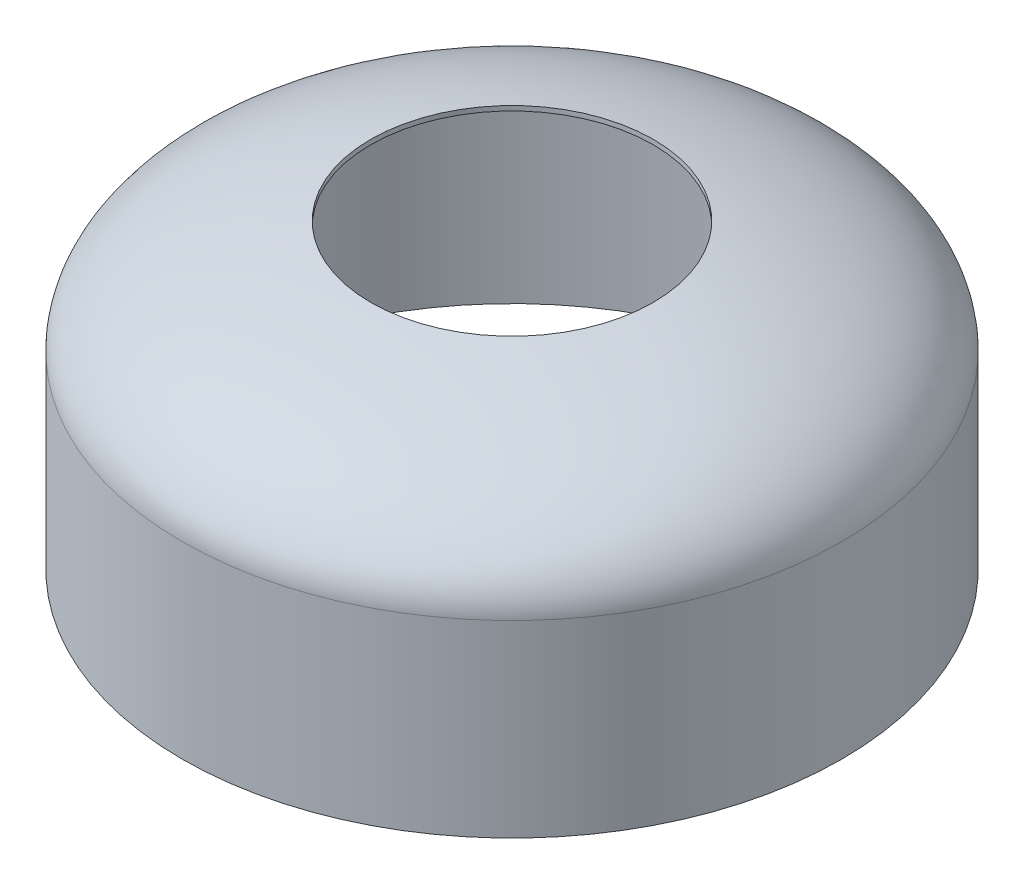
ISO-10303-21;
HEADER;
FILE_DESCRIPTION(('STEP AP214'),'2;1');
FILE_NAME('part.step','',(''),(''),'','','');
FILE_SCHEMA(('AUTOMOTIVE_DESIGN { 1 0 10303 214 1 1 1 1 }'));
ENDSEC;
DATA;
#1=APPLICATION_CONTEXT('core data for automotive mechanical design processes');
#2=APPLICATION_PROTOCOL_DEFINITION('international standard','automotive_design',2000,#1);
#3=PRODUCT_CONTEXT('',#1,'mechanical');
#4=PRODUCT('Part','Part','',(#3));
#5=PRODUCT_RELATED_PRODUCT_CATEGORY('part','',(#4));
#6=PRODUCT_DEFINITION_FORMATION('','',#4);
#7=PRODUCT_DEFINITION_CONTEXT('part definition',#1,'design');
#8=PRODUCT_DEFINITION('design','',#6,#7);
#9=PRODUCT_DEFINITION_SHAPE('','',#8);
#10=(LENGTH_UNIT() NAMED_UNIT(*) SI_UNIT(.MILLI.,.METRE.));
#11=(NAMED_UNIT(*) PLANE_ANGLE_UNIT() SI_UNIT($,.RADIAN.));
#12=(NAMED_UNIT(*) SI_UNIT($,.STERADIAN.) SOLID_ANGLE_UNIT());
#13=UNCERTAINTY_MEASURE_WITH_UNIT(LENGTH_MEASURE(1.E-05),#10,'distance_accuracy_value','');
#14=(GEOMETRIC_REPRESENTATION_CONTEXT(3) GLOBAL_UNCERTAINTY_ASSIGNED_CONTEXT((#13)) GLOBAL_UNIT_ASSIGNED_CONTEXT((#10,
#11,#12)) REPRESENTATION_CONTEXT('',''));
#15=CARTESIAN_POINT('',(0.,0.,0.));
#16=DIRECTION('',(0.,0.,1.));
#17=DIRECTION('',(1.,0.,0.));
#18=AXIS2_PLACEMENT_3D('',#15,#16,#17);
#19=CARTESIAN_POINT('',(175.26,-101.6,0.));
#20=DIRECTION('',(0.,-1.,0.));
#21=DIRECTION('',(0.,0.,-1.));
#22=AXIS2_PLACEMENT_3D('',#19,#20,#21);
#23=PLANE('',#22);
#24=CARTESIAN_POINT('',(0.,-101.6,0.));
#25=DIRECTION('',(0.,-1.,0.));
#26=DIRECTION('',(0.,0.,-1.));
#27=AXIS2_PLACEMENT_3D('',#24,#25,#26);
#28=CIRCLE('',#27,177.8);
#29=CARTESIAN_POINT('',(0.,-101.6,-177.8));
#30=VERTEX_POINT('',#29);
#31=EDGE_CURVE('E10',#30,#30,#28,.T.);
#32=ORIENTED_EDGE('',*,*,#31,.T.);
#33=EDGE_LOOP('',(#32));
#34=FACE_BOUND('',#33,.T.);
#35=CARTESIAN_POINT('',(0.,-101.6,0.));
#36=DIRECTION('',(0.,-1.,0.));
#37=DIRECTION('',(0.,0.,-1.));
#38=AXIS2_PLACEMENT_3D('',#35,#36,#37);
#39=CIRCLE('',#38,175.26);
#40=CARTESIAN_POINT('',(0.,-101.6,-175.26));
#41=VERTEX_POINT('',#40);
#42=EDGE_CURVE('E53',#41,#41,#39,.T.);
#43=ORIENTED_EDGE('',*,*,#42,.F.);
#44=EDGE_LOOP('',(#43));
#45=FACE_BOUND('',#44,.T.);
#46=ADVANCED_FACE('F31',(#34,#45),#23,.T.);
#47=CARTESIAN_POINT('',(0.,-109.728,0.));
#48=DIRECTION('',(0.,-1.,0.));
#49=DIRECTION('',(0.,0.,-1.));
#50=AXIS2_PLACEMENT_3D('',#47,#48,#49);
#51=CYLINDRICAL_SURFACE('',#50,177.8);
#52=CARTESIAN_POINT('',(0.,0.,0.));
#53=DIRECTION('',(0.,-1.,0.));
#54=DIRECTION('',(0.,0.,-1.));
#55=AXIS2_PLACEMENT_3D('',#52,#53,#54);
#56=CIRCLE('',#55,177.8);
#57=CARTESIAN_POINT('',(0.,0.,-177.8));
#58=VERTEX_POINT('',#57);
#59=EDGE_CURVE('E37',#58,#58,#56,.T.);
#60=ORIENTED_EDGE('',*,*,#59,.T.);
#61=EDGE_LOOP('',(#60));
#62=FACE_BOUND('',#61,.T.);
#63=ORIENTED_EDGE('',*,*,#31,.F.);
#64=EDGE_LOOP('',(#63));
#65=FACE_BOUND('',#64,.T.);
#66=ADVANCED_FACE('F72',(#62,#65),#51,.T.);
#67=CARTESIAN_POINT('',(0.,0.,0.));
#68=DIRECTION('',(0.,0.,1.));
#69=DIRECTION('',(1.,0.,0.));
#70=AXIS2_PLACEMENT_3D('',#67,#68,#69);
#71=ELLIPSE('',#70,177.8,67.4703561573525);
#72=TRIMMED_CURVE('',#71,(PARAMETER_VALUE(-1.5707963267949)),(PARAMETER_VALUE(1.5707963267949)),
.T.,.PARAMETER.);
#73=CARTESIAN_POINT('',(0.,-109.728,0.));
#74=DIRECTION('',(0.,-1.,0.));
#75=AXIS1_PLACEMENT('',#73,#74);
#76=SURFACE_OF_REVOLUTION('',#72,#75);
#77=CARTESIAN_POINT('',(0.,60.96,0.));
#78=DIRECTION('',(0.,-1.,0.));
#79=DIRECTION('',(0.,0.,-1.));
#80=AXIS2_PLACEMENT_3D('',#77,#78,#79);
#81=CIRCLE('',#80,76.2);
#82=CARTESIAN_POINT('',(0.,60.96,-76.2));
#83=VERTEX_POINT('',#82);
#84=EDGE_CURVE('E41',#83,#83,#81,.T.);
#85=ORIENTED_EDGE('',*,*,#84,.T.);
#86=EDGE_LOOP('',(#85));
#87=FACE_BOUND('',#86,.T.);
#88=ORIENTED_EDGE('',*,*,#59,.F.);
#89=EDGE_LOOP('',(#88));
#90=FACE_BOUND('',#89,.T.);
#91=ADVANCED_FACE('F69',(#87,#90),#76,.F.);
#92=CARTESIAN_POINT('',(0.,-109.728,0.));
#93=DIRECTION('',(0.,-1.,0.));
#94=DIRECTION('',(0.,0.,-1.));
#95=AXIS2_PLACEMENT_3D('',#92,#93,#94);
#96=CYLINDRICAL_SURFACE('',#95,76.2);
#97=CARTESIAN_POINT('',(0.,58.42,0.));
#98=DIRECTION('',(0.,-1.,0.));
#99=DIRECTION('',(0.,0.,-1.));
#100=AXIS2_PLACEMENT_3D('',#97,#98,#99);
#101=CIRCLE('',#100,76.2);
#102=CARTESIAN_POINT('',(0.,58.42,-76.2));
#103=VERTEX_POINT('',#102);
#104=EDGE_CURVE('E45',#103,#103,#101,.T.);
#105=ORIENTED_EDGE('',*,*,#104,.T.);
#106=EDGE_LOOP('',(#105));
#107=FACE_BOUND('',#106,.T.);
#108=ORIENTED_EDGE('',*,*,#84,.F.);
#109=EDGE_LOOP('',(#108));
#110=FACE_BOUND('',#109,.T.);
#111=ADVANCED_FACE('F65',(#107,#110),#96,.F.);
#112=CARTESIAN_POINT('',(0.,0.,0.));
#113=DIRECTION('',(0.,0.,-1.));
#114=DIRECTION('',(1.,0.,0.));
#115=AXIS2_PLACEMENT_3D('',#112,#113,#114);
#116=ELLIPSE('',#115,175.26,64.8725161095741);
#117=TRIMMED_CURVE('',#116,(PARAMETER_VALUE(4.71238898038469)),
(PARAMETER_VALUE(7.85398163397448)),.T.,.PARAMETER.);
#118=CARTESIAN_POINT('',(0.,-109.728,0.));
#119=DIRECTION('',(0.,-1.,0.));
#120=AXIS1_PLACEMENT('',#118,#119);
#121=SURFACE_OF_REVOLUTION('',#117,#120);
#122=CARTESIAN_POINT('',(0.,0.,0.));
#123=DIRECTION('',(0.,-1.,0.));
#124=DIRECTION('',(0.,0.,-1.));
#125=AXIS2_PLACEMENT_3D('',#122,#123,#124);
#126=CIRCLE('',#125,175.26);
#127=CARTESIAN_POINT('',(0.,0.,-175.26));
#128=VERTEX_POINT('',#127);
#129=EDGE_CURVE('E50',#128,#128,#126,.T.);
#130=ORIENTED_EDGE('',*,*,#129,.T.);
#131=EDGE_LOOP('',(#130));
#132=FACE_BOUND('',#131,.T.);
#133=ORIENTED_EDGE('',*,*,#104,.F.);
#134=EDGE_LOOP('',(#133));
#135=FACE_BOUND('',#134,.T.);
#136=ADVANCED_FACE('F60',(#132,#135),#121,.F.);
#137=CARTESIAN_POINT('',(0.,-109.728,0.));
#138=DIRECTION('',(0.,-1.,0.));
#139=DIRECTION('',(0.,0.,-1.));
#140=AXIS2_PLACEMENT_3D('',#137,#138,#139);
#141=CYLINDRICAL_SURFACE('',#140,175.26);
#142=ORIENTED_EDGE('',*,*,#42,.T.);
#143=EDGE_LOOP('',(#142));
#144=FACE_BOUND('',#143,.T.);
#145=ORIENTED_EDGE('',*,*,#129,.F.);
#146=EDGE_LOOP('',(#145));
#147=FACE_BOUND('',#146,.T.);
#148=ADVANCED_FACE('F64',(#144,#147),#141,.F.);
#149=CLOSED_SHELL('',(#46,#66,#91,#111,#136,#148));
#150=MANIFOLD_SOLID_BREP('B2',#149);
#151=ADVANCED_BREP_SHAPE_REPRESENTATION('',(#18,#150),#14);
#152=SHAPE_DEFINITION_REPRESENTATION(#9,#151);
ENDSEC;
END-ISO-10303-21;
